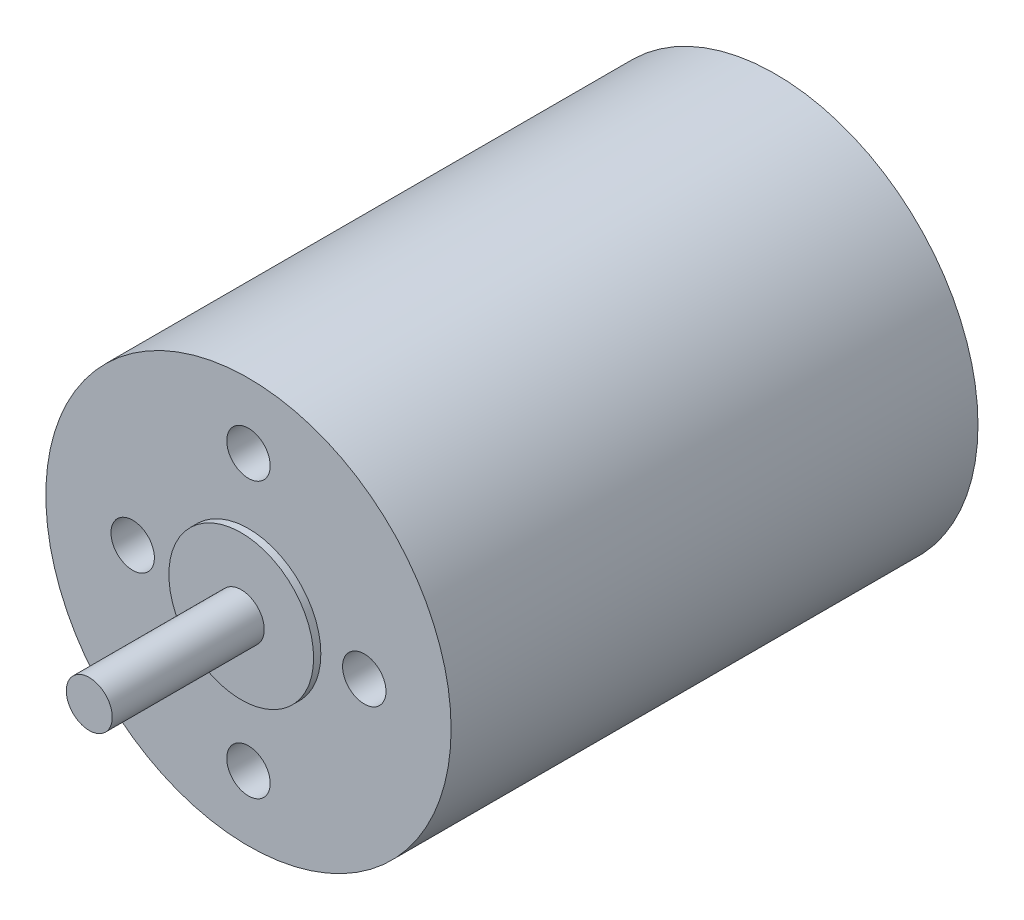
ISO-10303-21;
HEADER;
FILE_DESCRIPTION(('STEP AP214'),'2;1');
FILE_NAME('part.step','',(''),(''),'','','');
FILE_SCHEMA(('AUTOMOTIVE_DESIGN { 1 0 10303 214 1 1 1 1 }'));
ENDSEC;
DATA;
#1=APPLICATION_CONTEXT('core data for automotive mechanical design processes');
#2=APPLICATION_PROTOCOL_DEFINITION('international standard','automotive_design',2000,#1);
#3=PRODUCT_CONTEXT('',#1,'mechanical');
#4=PRODUCT('Part','Part','',(#3));
#5=PRODUCT_RELATED_PRODUCT_CATEGORY('part','',(#4));
#6=PRODUCT_DEFINITION_FORMATION('','',#4);
#7=PRODUCT_DEFINITION_CONTEXT('part definition',#1,'design');
#8=PRODUCT_DEFINITION('design','',#6,#7);
#9=PRODUCT_DEFINITION_SHAPE('','',#8);
#10=(LENGTH_UNIT() NAMED_UNIT(*) SI_UNIT(.MILLI.,.METRE.));
#11=(NAMED_UNIT(*) PLANE_ANGLE_UNIT() SI_UNIT($,.RADIAN.));
#12=(NAMED_UNIT(*) SI_UNIT($,.STERADIAN.) SOLID_ANGLE_UNIT());
#13=UNCERTAINTY_MEASURE_WITH_UNIT(LENGTH_MEASURE(1.E-05),#10,'distance_accuracy_value','');
#14=(GEOMETRIC_REPRESENTATION_CONTEXT(3) GLOBAL_UNCERTAINTY_ASSIGNED_CONTEXT((#13)) GLOBAL_UNIT_ASSIGNED_CONTEXT((#10,
#11,#12)) REPRESENTATION_CONTEXT('',''));
#15=CARTESIAN_POINT('',(0.,0.,0.));
#16=DIRECTION('',(0.,0.,1.));
#17=DIRECTION('',(1.,0.,0.));
#18=AXIS2_PLACEMENT_3D('',#15,#16,#17);
#19=CARTESIAN_POINT('',(0.,0.,36.4));
#20=DIRECTION('',(0.,0.,-1.));
#21=DIRECTION('',(-1.,0.,0.));
#22=AXIS2_PLACEMENT_3D('',#19,#20,#21);
#23=CYLINDRICAL_SURFACE('',#22,14.);
#24=CARTESIAN_POINT('',(0.,0.,36.4));
#25=DIRECTION('',(0.,0.,1.));
#26=DIRECTION('',(1.,0.,0.));
#27=AXIS2_PLACEMENT_3D('',#24,#25,#26);
#28=CIRCLE('',#27,14.);
#29=CARTESIAN_POINT('',(14.,0.,36.4));
#30=VERTEX_POINT('',#29);
#31=EDGE_CURVE('E11',#30,#30,#28,.T.);
#32=ORIENTED_EDGE('',*,*,#31,.F.);
#33=EDGE_LOOP('',(#32));
#34=FACE_BOUND('',#33,.T.);
#35=CARTESIAN_POINT('',(0.,0.,0.));
#36=DIRECTION('',(0.,0.,1.));
#37=DIRECTION('',(1.,0.,0.));
#38=AXIS2_PLACEMENT_3D('',#35,#36,#37);
#39=CIRCLE('',#38,14.);
#40=CARTESIAN_POINT('',(14.,0.,0.));
#41=VERTEX_POINT('',#40);
#42=EDGE_CURVE('E36',#41,#41,#39,.T.);
#43=ORIENTED_EDGE('',*,*,#42,.T.);
#44=EDGE_LOOP('',(#43));
#45=FACE_BOUND('',#44,.T.);
#46=ADVANCED_FACE('F33',(#34,#45),#23,.T.);
#47=CARTESIAN_POINT('',(0.,0.,36.4));
#48=DIRECTION('',(0.,0.,1.));
#49=DIRECTION('',(1.,0.,0.));
#50=AXIS2_PLACEMENT_3D('',#47,#48,#49);
#51=PLANE('',#50);
#52=CARTESIAN_POINT('',(0.,9.5,36.4));
#53=DIRECTION('',(0.,0.,1.));
#54=DIRECTION('',(1.,0.,0.));
#55=AXIS2_PLACEMENT_3D('',#52,#53,#54);
#56=CIRCLE('',#55,1.49999999999999);
#57=CARTESIAN_POINT('',(1.49999999999999,9.5,36.4));
#58=VERTEX_POINT('',#57);
#59=EDGE_CURVE('E64',#58,#58,#56,.T.);
#60=ORIENTED_EDGE('',*,*,#59,.F.);
#61=EDGE_LOOP('',(#60));
#62=FACE_BOUND('',#61,.T.);
#63=CARTESIAN_POINT('',(0.,-9.5,36.4));
#64=DIRECTION('',(0.,0.,1.));
#65=DIRECTION('',(1.,0.,0.));
#66=AXIS2_PLACEMENT_3D('',#63,#64,#65);
#67=CIRCLE('',#66,1.49999999999999);
#68=CARTESIAN_POINT('',(1.49999999999999,-9.5,36.4));
#69=VERTEX_POINT('',#68);
#70=EDGE_CURVE('E63',#69,#69,#67,.T.);
#71=ORIENTED_EDGE('',*,*,#70,.F.);
#72=EDGE_LOOP('',(#71));
#73=FACE_BOUND('',#72,.T.);
#74=CARTESIAN_POINT('',(8.,0.,36.4));
#75=DIRECTION('',(0.,0.,1.));
#76=DIRECTION('',(1.,0.,0.));
#77=AXIS2_PLACEMENT_3D('',#74,#75,#76);
#78=CIRCLE('',#77,1.49999999999999);
#79=CARTESIAN_POINT('',(9.49999999999999,0.,36.4));
#80=VERTEX_POINT('',#79);
#81=EDGE_CURVE('E74',#80,#80,#78,.T.);
#82=ORIENTED_EDGE('',*,*,#81,.F.);
#83=EDGE_LOOP('',(#82));
#84=FACE_BOUND('',#83,.T.);
#85=CARTESIAN_POINT('',(-8.,0.,36.4));
#86=DIRECTION('',(0.,0.,1.));
#87=DIRECTION('',(1.,0.,0.));
#88=AXIS2_PLACEMENT_3D('',#85,#86,#87);
#89=CIRCLE('',#88,1.49999999999999);
#90=CARTESIAN_POINT('',(-6.50000000000001,0.,36.4));
#91=VERTEX_POINT('',#90);
#92=EDGE_CURVE('E80',#91,#91,#89,.T.);
#93=ORIENTED_EDGE('',*,*,#92,.F.);
#94=EDGE_LOOP('',(#93));
#95=FACE_BOUND('',#94,.T.);
#96=CARTESIAN_POINT('',(0.,0.,36.4));
#97=DIRECTION('',(0.,0.,1.));
#98=DIRECTION('',(1.,0.,0.));
#99=AXIS2_PLACEMENT_3D('',#96,#97,#98);
#100=CIRCLE('',#99,5.);
#101=CARTESIAN_POINT('',(5.,0.,36.4));
#102=VERTEX_POINT('',#101);
#103=EDGE_CURVE('E90',#102,#102,#100,.T.);
#104=ORIENTED_EDGE('',*,*,#103,.F.);
#105=EDGE_LOOP('',(#104));
#106=FACE_BOUND('',#105,.T.);
#107=ORIENTED_EDGE('',*,*,#31,.T.);
#108=EDGE_LOOP('',(#107));
#109=FACE_BOUND('',#108,.T.);
#110=ADVANCED_FACE('F101',(#62,#73,#84,#95,#106,#109),#51,.T.);
#111=CARTESIAN_POINT('',(0.,0.,0.));
#112=DIRECTION('',(0.,0.,1.));
#113=DIRECTION('',(1.,0.,0.));
#114=AXIS2_PLACEMENT_3D('',#111,#112,#113);
#115=PLANE('',#114);
#116=ORIENTED_EDGE('',*,*,#42,.F.);
#117=EDGE_LOOP('',(#116));
#118=FACE_BOUND('',#117,.T.);
#119=ADVANCED_FACE('F104',(#118),#115,.F.);
#120=CARTESIAN_POINT('',(0.,0.,36.9));
#121=DIRECTION('',(0.,0.,-1.));
#122=DIRECTION('',(-1.,0.,0.));
#123=AXIS2_PLACEMENT_3D('',#120,#121,#122);
#124=CYLINDRICAL_SURFACE('',#123,5.);
#125=CARTESIAN_POINT('',(0.,0.,36.9));
#126=DIRECTION('',(0.,0.,1.));
#127=DIRECTION('',(1.,0.,0.));
#128=AXIS2_PLACEMENT_3D('',#125,#126,#127);
#129=CIRCLE('',#128,5.);
#130=CARTESIAN_POINT('',(5.,0.,36.9));
#131=VERTEX_POINT('',#130);
#132=EDGE_CURVE('E93',#131,#131,#129,.T.);
#133=ORIENTED_EDGE('',*,*,#132,.F.);
#134=EDGE_LOOP('',(#133));
#135=FACE_BOUND('',#134,.T.);
#136=ORIENTED_EDGE('',*,*,#103,.T.);
#137=EDGE_LOOP('',(#136));
#138=FACE_BOUND('',#137,.T.);
#139=ADVANCED_FACE('F99',(#135,#138),#124,.T.);
#140=CARTESIAN_POINT('',(0.,0.,36.9));
#141=DIRECTION('',(0.,0.,1.));
#142=DIRECTION('',(1.,0.,0.));
#143=AXIS2_PLACEMENT_3D('',#140,#141,#142);
#144=PLANE('',#143);
#145=CARTESIAN_POINT('',(0.,0.,36.9));
#146=DIRECTION('',(0.,0.,1.));
#147=DIRECTION('',(1.,0.,0.));
#148=AXIS2_PLACEMENT_3D('',#145,#146,#147);
#149=CIRCLE('',#148,1.5875);
#150=CARTESIAN_POINT('',(-1.5875,0.,36.9));
#151=VERTEX_POINT('',#150);
#152=EDGE_CURVE('E86',#151,#151,#149,.T.);
#153=ORIENTED_EDGE('',*,*,#152,.F.);
#154=EDGE_LOOP('',(#153));
#155=FACE_BOUND('',#154,.T.);
#156=ORIENTED_EDGE('',*,*,#132,.T.);
#157=EDGE_LOOP('',(#156));
#158=FACE_BOUND('',#157,.T.);
#159=ADVANCED_FACE('F118',(#155,#158),#144,.T.);
#160=CARTESIAN_POINT('',(0.,0.,47.4));
#161=DIRECTION('',(0.,0.,-1.));
#162=DIRECTION('',(-1.,0.,0.));
#163=AXIS2_PLACEMENT_3D('',#160,#161,#162);
#164=CYLINDRICAL_SURFACE('',#163,1.5875);
#165=CARTESIAN_POINT('',(0.,0.,47.4));
#166=DIRECTION('',(0.,0.,1.));
#167=DIRECTION('',(1.,0.,0.));
#168=AXIS2_PLACEMENT_3D('',#165,#166,#167);
#169=CIRCLE('',#168,1.5875);
#170=CARTESIAN_POINT('',(-1.5875,0.,47.4));
#171=VERTEX_POINT('',#170);
#172=EDGE_CURVE('E87',#171,#171,#169,.T.);
#173=CARTESIAN_POINT('',(-1.5875,0.,47.4));
#174=CARTESIAN_POINT('',(-1.5875,0.,47.290625));
#175=CARTESIAN_POINT('',(-1.5875,0.,47.18125));
#176=CARTESIAN_POINT('',(-1.5875,0.,46.9625));
#177=CARTESIAN_POINT('',(-1.5875,0.,46.853125));
#178=CARTESIAN_POINT('',(-1.5875,0.,46.634375));
#179=CARTESIAN_POINT('',(-1.5875,0.,46.525));
#180=CARTESIAN_POINT('',(-1.5875,0.,46.30625));
#181=CARTESIAN_POINT('',(-1.5875,0.,46.196875));
#182=CARTESIAN_POINT('',(-1.5875,0.,45.978125));
#183=CARTESIAN_POINT('',(-1.5875,0.,45.86875));
#184=CARTESIAN_POINT('',(-1.5875,0.,45.65));
#185=CARTESIAN_POINT('',(-1.5875,0.,45.540625));
#186=CARTESIAN_POINT('',(-1.5875,0.,45.321875));
#187=CARTESIAN_POINT('',(-1.5875,0.,45.2125));
#188=CARTESIAN_POINT('',(-1.5875,0.,44.99375));
#189=CARTESIAN_POINT('',(-1.5875,0.,44.884375));
#190=CARTESIAN_POINT('',(-1.5875,0.,44.665625));
#191=CARTESIAN_POINT('',(-1.5875,0.,44.55625));
#192=CARTESIAN_POINT('',(-1.5875,0.,44.3375));
#193=CARTESIAN_POINT('',(-1.5875,0.,44.228125));
#194=CARTESIAN_POINT('',(-1.5875,0.,44.009375));
#195=CARTESIAN_POINT('',(-1.5875,0.,43.9));
#196=CARTESIAN_POINT('',(-1.5875,0.,43.68125));
#197=CARTESIAN_POINT('',(-1.5875,0.,43.571875));
#198=CARTESIAN_POINT('',(-1.5875,0.,43.353125));
#199=CARTESIAN_POINT('',(-1.5875,0.,43.24375));
#200=CARTESIAN_POINT('',(-1.5875,0.,43.025));
#201=CARTESIAN_POINT('',(-1.5875,0.,42.915625));
#202=CARTESIAN_POINT('',(-1.5875,0.,42.696875));
#203=CARTESIAN_POINT('',(-1.5875,0.,42.5875));
#204=CARTESIAN_POINT('',(-1.5875,0.,42.36875));
#205=CARTESIAN_POINT('',(-1.5875,0.,42.259375));
#206=CARTESIAN_POINT('',(-1.5875,0.,42.040625));
#207=CARTESIAN_POINT('',(-1.5875,0.,41.93125));
#208=CARTESIAN_POINT('',(-1.5875,0.,41.7125));
#209=CARTESIAN_POINT('',(-1.5875,0.,41.603125));
#210=CARTESIAN_POINT('',(-1.5875,0.,41.384375));
#211=CARTESIAN_POINT('',(-1.5875,0.,41.275));
#212=CARTESIAN_POINT('',(-1.5875,0.,41.05625));
#213=CARTESIAN_POINT('',(-1.5875,0.,40.946875));
#214=CARTESIAN_POINT('',(-1.5875,0.,40.728125));
#215=CARTESIAN_POINT('',(-1.5875,0.,40.61875));
#216=CARTESIAN_POINT('',(-1.5875,0.,40.4));
#217=CARTESIAN_POINT('',(-1.5875,0.,40.290625));
#218=CARTESIAN_POINT('',(-1.5875,0.,40.071875));
#219=CARTESIAN_POINT('',(-1.5875,0.,39.9625));
#220=CARTESIAN_POINT('',(-1.5875,0.,39.74375));
#221=CARTESIAN_POINT('',(-1.5875,0.,39.634375));
#222=CARTESIAN_POINT('',(-1.5875,0.,39.415625));
#223=CARTESIAN_POINT('',(-1.5875,0.,39.30625));
#224=CARTESIAN_POINT('',(-1.5875,0.,39.0875));
#225=CARTESIAN_POINT('',(-1.5875,0.,38.978125));
#226=CARTESIAN_POINT('',(-1.5875,0.,38.759375));
#227=CARTESIAN_POINT('',(-1.5875,0.,38.65));
#228=CARTESIAN_POINT('',(-1.5875,0.,38.43125));
#229=CARTESIAN_POINT('',(-1.5875,0.,38.321875));
#230=CARTESIAN_POINT('',(-1.5875,0.,38.103125));
#231=CARTESIAN_POINT('',(-1.5875,0.,37.99375));
#232=CARTESIAN_POINT('',(-1.5875,0.,37.775));
#233=CARTESIAN_POINT('',(-1.5875,0.,37.665625));
#234=CARTESIAN_POINT('',(-1.5875,0.,37.446875));
#235=CARTESIAN_POINT('',(-1.5875,0.,37.3375));
#236=CARTESIAN_POINT('',(-1.5875,0.,37.11875));
#237=CARTESIAN_POINT('',(-1.5875,0.,37.009375));
#238=CARTESIAN_POINT('',(-1.5875,0.,36.9));
#239=B_SPLINE_CURVE_WITH_KNOTS('',3,(#173,#174,#175,#176,#177,#178,#179,#180,#181,#182,#183,
#184,#185,#186,#187,#188,#189,#190,#191,#192,#193,#194,#195,#196,#197,#198,#199,#200,#201,#202,
#203,#204,#205,#206,#207,#208,#209,#210,#211,#212,#213,#214,#215,#216,#217,#218,#219,#220,#221,
#222,#223,#224,#225,#226,#227,#228,#229,#230,#231,#232,#233,#234,#235,#236,#237,#238),
.UNSPECIFIED.,.F.,.F.,(4,2,2,2,2,2,2,2,2,2,2,2,2,2,2,2,2,2,2,2,2,2,2,2,2,2,2,2,2,2,2,2,4),(0.,
0.328125000000005,0.656250000000004,0.984375000000003,1.3125,1.64062500000001,1.96875000000001,
2.296875,2.625,2.95312500000001,3.28125000000001,3.609375,3.9375,4.265625,4.59375000000001,
4.92187500000001,5.25,5.578125,5.90625000000001,6.23437500000001,6.56250000000001,6.890625,
7.21875,7.54687500000001,7.87500000000001,8.20312500000001,8.53125,8.85937500000001,
9.18750000000001,9.51562500000001,9.84375000000001,10.171875,10.5),.UNSPECIFIED.);
#240=EDGE_CURVE('BSEAM124',#171,#151,#239,.T.);
#241=ORIENTED_EDGE('',*,*,#172,.F.);
#242=ORIENTED_EDGE('',*,*,#152,.T.);
#243=ORIENTED_EDGE('',*,*,#240,.T.);
#244=ORIENTED_EDGE('',*,*,#240,.F.);
#245=EDGE_LOOP('',(#241,#243,#242,#244));
#246=FACE_BOUND('',#245,.T.);
#247=ADVANCED_FACE('F124',(#246),#164,.T.);
#248=CARTESIAN_POINT('',(0.,0.,47.4));
#249=DIRECTION('',(0.,0.,1.));
#250=DIRECTION('',(1.,0.,0.));
#251=AXIS2_PLACEMENT_3D('',#248,#249,#250);
#252=PLANE('',#251);
#253=ORIENTED_EDGE('',*,*,#172,.T.);
#254=EDGE_LOOP('',(#253));
#255=FACE_BOUND('',#254,.T.);
#256=ADVANCED_FACE('F128',(#255),#252,.T.);
#257=CARTESIAN_POINT('',(-8.,0.,32.4));
#258=DIRECTION('',(0.,0.,1.));
#259=DIRECTION('',(1.,0.,0.));
#260=AXIS2_PLACEMENT_3D('',#257,#258,#259);
#261=CONICAL_SURFACE('',#260,1.5,1.02974425867665);
#262=CARTESIAN_POINT('',(-8.,0.,31.4987090714587));
#263=VERTEX_POINT('',#262);
#264=VERTEX_LOOP('',#263);
#265=FACE_BOUND('',#264,.T.);
#266=CARTESIAN_POINT('',(-8.,0.,32.4));
#267=DIRECTION('',(0.,0.,1.));
#268=DIRECTION('',(1.,0.,0.));
#269=AXIS2_PLACEMENT_3D('',#266,#267,#268);
#270=CIRCLE('',#269,1.5);
#271=CARTESIAN_POINT('',(-6.5,0.,32.4));
#272=VERTEX_POINT('',#271);
#273=EDGE_CURVE('E83',#272,#272,#270,.T.);
#274=ORIENTED_EDGE('',*,*,#273,.T.);
#275=EDGE_LOOP('',(#274));
#276=FACE_BOUND('',#275,.T.);
#277=ADVANCED_FACE('F132',(#265,#276),#261,.F.);
#278=CARTESIAN_POINT('',(-8.,0.,36.4));
#279=DIRECTION('',(0.,0.,1.));
#280=DIRECTION('',(1.,0.,0.));
#281=AXIS2_PLACEMENT_3D('',#278,#279,#280);
#282=CYLINDRICAL_SURFACE('',#281,1.49999999999999);
#283=ORIENTED_EDGE('',*,*,#273,.F.);
#284=EDGE_LOOP('',(#283));
#285=FACE_BOUND('',#284,.T.);
#286=ORIENTED_EDGE('',*,*,#92,.T.);
#287=EDGE_LOOP('',(#286));
#288=FACE_BOUND('',#287,.T.);
#289=ADVANCED_FACE('F136',(#285,#288),#282,.F.);
#290=CARTESIAN_POINT('',(8.,0.,32.4));
#291=DIRECTION('',(0.,0.,1.));
#292=DIRECTION('',(1.,0.,0.));
#293=AXIS2_PLACEMENT_3D('',#290,#291,#292);
#294=CONICAL_SURFACE('',#293,1.5,1.02974425867665);
#295=CARTESIAN_POINT('',(8.,0.,31.4987090714587));
#296=VERTEX_POINT('',#295);
#297=VERTEX_LOOP('',#296);
#298=FACE_BOUND('',#297,.T.);
#299=CARTESIAN_POINT('',(8.,0.,32.4));
#300=DIRECTION('',(0.,0.,1.));
#301=DIRECTION('',(1.,0.,0.));
#302=AXIS2_PLACEMENT_3D('',#299,#300,#301);
#303=CIRCLE('',#302,1.5);
#304=CARTESIAN_POINT('',(9.5,0.,32.4));
#305=VERTEX_POINT('',#304);
#306=EDGE_CURVE('E77',#305,#305,#303,.T.);
#307=ORIENTED_EDGE('',*,*,#306,.T.);
#308=EDGE_LOOP('',(#307));
#309=FACE_BOUND('',#308,.T.);
#310=ADVANCED_FACE('F139',(#298,#309),#294,.F.);
#311=CARTESIAN_POINT('',(8.,0.,36.4));
#312=DIRECTION('',(0.,0.,1.));
#313=DIRECTION('',(1.,0.,0.));
#314=AXIS2_PLACEMENT_3D('',#311,#312,#313);
#315=CYLINDRICAL_SURFACE('',#314,1.49999999999999);
#316=ORIENTED_EDGE('',*,*,#306,.F.);
#317=EDGE_LOOP('',(#316));
#318=FACE_BOUND('',#317,.T.);
#319=ORIENTED_EDGE('',*,*,#81,.T.);
#320=EDGE_LOOP('',(#319));
#321=FACE_BOUND('',#320,.T.);
#322=ADVANCED_FACE('F143',(#318,#321),#315,.F.);
#323=CARTESIAN_POINT('',(0.,-9.5,32.4));
#324=DIRECTION('',(0.,0.,1.));
#325=DIRECTION('',(1.,0.,0.));
#326=AXIS2_PLACEMENT_3D('',#323,#324,#325);
#327=CONICAL_SURFACE('',#326,1.5,1.02974425867665);
#328=CARTESIAN_POINT('',(0.,-9.5,31.4987090714587));
#329=VERTEX_POINT('',#328);
#330=VERTEX_LOOP('',#329);
#331=FACE_BOUND('',#330,.T.);
#332=CARTESIAN_POINT('',(0.,-9.5,32.4));
#333=DIRECTION('',(0.,0.,1.));
#334=DIRECTION('',(1.,0.,0.));
#335=AXIS2_PLACEMENT_3D('',#332,#333,#334);
#336=CIRCLE('',#335,1.5);
#337=CARTESIAN_POINT('',(1.5,-9.5,32.4));
#338=VERTEX_POINT('',#337);
#339=EDGE_CURVE('E67',#338,#338,#336,.T.);
#340=ORIENTED_EDGE('',*,*,#339,.T.);
#341=EDGE_LOOP('',(#340));
#342=FACE_BOUND('',#341,.T.);
#343=ADVANCED_FACE('F146',(#331,#342),#327,.F.);
#344=CARTESIAN_POINT('',(0.,-9.5,36.4));
#345=DIRECTION('',(0.,0.,1.));
#346=DIRECTION('',(1.,0.,0.));
#347=AXIS2_PLACEMENT_3D('',#344,#345,#346);
#348=CYLINDRICAL_SURFACE('',#347,1.49999999999999);
#349=ORIENTED_EDGE('',*,*,#339,.F.);
#350=EDGE_LOOP('',(#349));
#351=FACE_BOUND('',#350,.T.);
#352=ORIENTED_EDGE('',*,*,#70,.T.);
#353=EDGE_LOOP('',(#352));
#354=FACE_BOUND('',#353,.T.);
#355=ADVANCED_FACE('F57',(#351,#354),#348,.F.);
#356=CARTESIAN_POINT('',(0.,9.5,32.4));
#357=DIRECTION('',(0.,0.,1.));
#358=DIRECTION('',(1.,0.,0.));
#359=AXIS2_PLACEMENT_3D('',#356,#357,#358);
#360=CONICAL_SURFACE('',#359,1.5,1.02974425867665);
#361=CARTESIAN_POINT('',(0.,9.5,31.4987090714587));
#362=VERTEX_POINT('',#361);
#363=VERTEX_LOOP('',#362);
#364=FACE_BOUND('',#363,.T.);
#365=CARTESIAN_POINT('',(0.,9.5,32.4));
#366=DIRECTION('',(0.,0.,1.));
#367=DIRECTION('',(1.,0.,0.));
#368=AXIS2_PLACEMENT_3D('',#365,#366,#367);
#369=CIRCLE('',#368,1.5);
#370=CARTESIAN_POINT('',(1.5,9.5,32.4));
#371=VERTEX_POINT('',#370);
#372=EDGE_CURVE('E61',#371,#371,#369,.T.);
#373=ORIENTED_EDGE('',*,*,#372,.T.);
#374=EDGE_LOOP('',(#373));
#375=FACE_BOUND('',#374,.T.);
#376=ADVANCED_FACE('F53',(#364,#375),#360,.F.);
#377=CARTESIAN_POINT('',(0.,9.5,36.4));
#378=DIRECTION('',(0.,0.,1.));
#379=DIRECTION('',(1.,0.,0.));
#380=AXIS2_PLACEMENT_3D('',#377,#378,#379);
#381=CYLINDRICAL_SURFACE('',#380,1.49999999999999);
#382=ORIENTED_EDGE('',*,*,#372,.F.);
#383=EDGE_LOOP('',(#382));
#384=FACE_BOUND('',#383,.T.);
#385=ORIENTED_EDGE('',*,*,#59,.T.);
#386=EDGE_LOOP('',(#385));
#387=FACE_BOUND('',#386,.T.);
#388=ADVANCED_FACE('F56',(#384,#387),#381,.F.);
#389=CLOSED_SHELL('',(#46,#110,#119,#139,#159,#247,#256,#277,#289,#310,#322,#343,#355,#376,#388));
#390=MANIFOLD_SOLID_BREP('B2',#389);
#391=ADVANCED_BREP_SHAPE_REPRESENTATION('',(#18,#390),#14);
#392=SHAPE_DEFINITION_REPRESENTATION(#9,#391);
ENDSEC;
END-ISO-10303-21;
